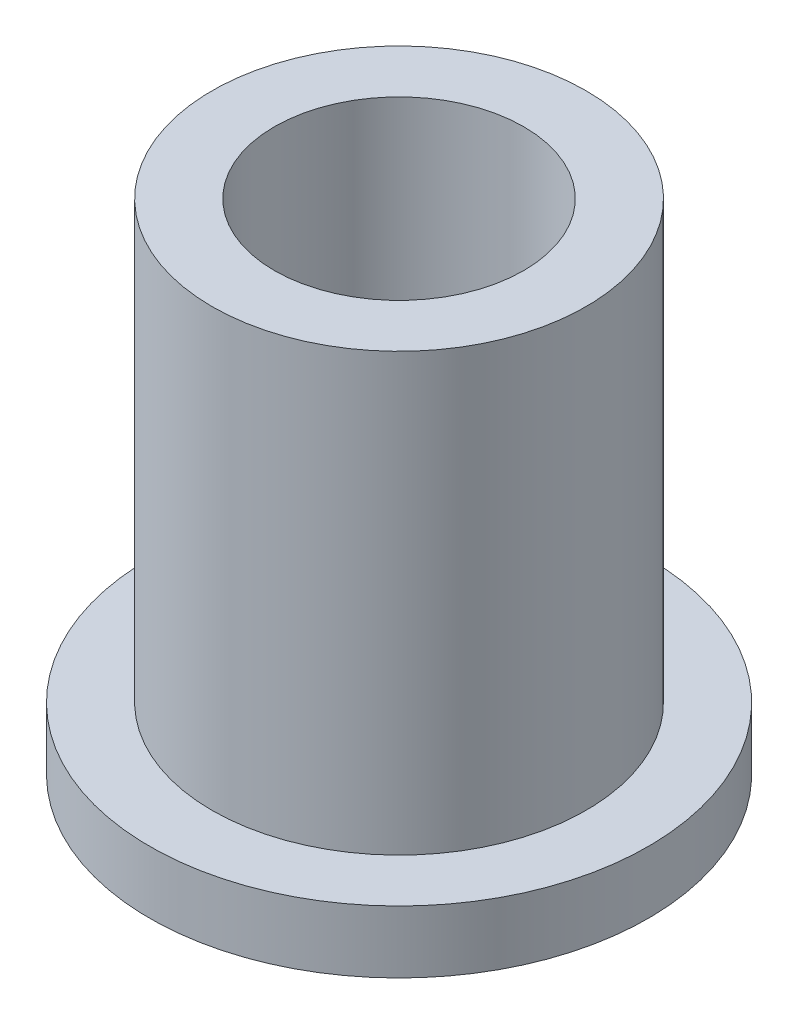
ISO-10303-21;
HEADER;
FILE_DESCRIPTION(('STEP AP214'),'2;1');
FILE_NAME('part.step','',(''),(''),'','','');
FILE_SCHEMA(('AUTOMOTIVE_DESIGN { 1 0 10303 214 1 1 1 1 }'));
ENDSEC;
DATA;
#1=APPLICATION_CONTEXT('core data for automotive mechanical design processes');
#2=APPLICATION_PROTOCOL_DEFINITION('international standard','automotive_design',2000,#1);
#3=PRODUCT_CONTEXT('',#1,'mechanical');
#4=PRODUCT('Part','Part','',(#3));
#5=PRODUCT_RELATED_PRODUCT_CATEGORY('part','',(#4));
#6=PRODUCT_DEFINITION_FORMATION('','',#4);
#7=PRODUCT_DEFINITION_CONTEXT('part definition',#1,'design');
#8=PRODUCT_DEFINITION('design','',#6,#7);
#9=PRODUCT_DEFINITION_SHAPE('','',#8);
#10=(LENGTH_UNIT() NAMED_UNIT(*) SI_UNIT(.MILLI.,.METRE.));
#11=(NAMED_UNIT(*) PLANE_ANGLE_UNIT() SI_UNIT($,.RADIAN.));
#12=(NAMED_UNIT(*) SI_UNIT($,.STERADIAN.) SOLID_ANGLE_UNIT());
#13=UNCERTAINTY_MEASURE_WITH_UNIT(LENGTH_MEASURE(1.E-05),#10,'distance_accuracy_value','');
#14=(GEOMETRIC_REPRESENTATION_CONTEXT(3) GLOBAL_UNCERTAINTY_ASSIGNED_CONTEXT((#13)) GLOBAL_UNIT_ASSIGNED_CONTEXT((#10,
#11,#12)) REPRESENTATION_CONTEXT('',''));
#15=CARTESIAN_POINT('',(0.,0.,0.));
#16=DIRECTION('',(0.,0.,1.));
#17=DIRECTION('',(1.,0.,0.));
#18=AXIS2_PLACEMENT_3D('',#15,#16,#17);
#19=CARTESIAN_POINT('',(0.,12.7,0.));
#20=DIRECTION('',(0.,-1.,0.));
#21=DIRECTION('',(0.,0.,-1.));
#22=AXIS2_PLACEMENT_3D('',#19,#20,#21);
#23=CYLINDRICAL_SURFACE('',#22,4.7625);
#24=CARTESIAN_POINT('',(0.,12.7,0.));
#25=DIRECTION('',(0.,1.,0.));
#26=DIRECTION('',(0.,0.,1.));
#27=AXIS2_PLACEMENT_3D('',#24,#25,#26);
#28=CIRCLE('',#27,4.7625);
#29=CARTESIAN_POINT('',(0.,12.7,4.7625));
#30=VERTEX_POINT('',#29);
#31=EDGE_CURVE('E37',#30,#30,#28,.T.);
#32=ORIENTED_EDGE('',*,*,#31,.F.);
#33=EDGE_LOOP('',(#32));
#34=FACE_BOUND('',#33,.T.);
#35=CARTESIAN_POINT('',(0.,1.5875,0.));
#36=DIRECTION('',(0.,-1.,0.));
#37=DIRECTION('',(0.,0.,-1.));
#38=AXIS2_PLACEMENT_3D('',#35,#36,#37);
#39=CIRCLE('',#38,4.7625);
#40=CARTESIAN_POINT('',(0.,1.5875,-4.7625));
#41=VERTEX_POINT('',#40);
#42=EDGE_CURVE('E10',#41,#41,#39,.T.);
#43=ORIENTED_EDGE('',*,*,#42,.F.);
#44=EDGE_LOOP('',(#43));
#45=FACE_BOUND('',#44,.T.);
#46=ADVANCED_FACE('F31',(#34,#45),#23,.T.);
#47=CARTESIAN_POINT('',(0.,12.7,0.));
#48=DIRECTION('',(0.,1.,0.));
#49=DIRECTION('',(0.,0.,1.));
#50=AXIS2_PLACEMENT_3D('',#47,#48,#49);
#51=PLANE('',#50);
#52=ORIENTED_EDGE('',*,*,#31,.T.);
#53=EDGE_LOOP('',(#52));
#54=FACE_BOUND('',#53,.T.);
#55=CARTESIAN_POINT('',(0.,12.7,0.));
#56=DIRECTION('',(0.,1.,0.));
#57=DIRECTION('',(0.,0.,1.));
#58=AXIS2_PLACEMENT_3D('',#55,#56,#57);
#59=CIRCLE('',#58,3.175);
#60=CARTESIAN_POINT('',(0.,12.7,3.175));
#61=VERTEX_POINT('',#60);
#62=EDGE_CURVE('E41',#61,#61,#59,.T.);
#63=ORIENTED_EDGE('',*,*,#62,.F.);
#64=EDGE_LOOP('',(#63));
#65=FACE_BOUND('',#64,.T.);
#66=ADVANCED_FACE('F69',(#54,#65),#51,.T.);
#67=CARTESIAN_POINT('',(0.,0.,0.));
#68=DIRECTION('',(0.,1.,0.));
#69=DIRECTION('',(0.,0.,1.));
#70=AXIS2_PLACEMENT_3D('',#67,#68,#69);
#71=PLANE('',#70);
#72=CARTESIAN_POINT('',(0.,0.,0.));
#73=DIRECTION('',(0.,1.,0.));
#74=DIRECTION('',(0.,0.,1.));
#75=AXIS2_PLACEMENT_3D('',#72,#73,#74);
#76=CIRCLE('',#75,3.175);
#77=CARTESIAN_POINT('',(0.,0.,3.175));
#78=VERTEX_POINT('',#77);
#79=EDGE_CURVE('E45',#78,#78,#76,.T.);
#80=ORIENTED_EDGE('',*,*,#79,.T.);
#81=EDGE_LOOP('',(#80));
#82=FACE_BOUND('',#81,.T.);
#83=CARTESIAN_POINT('',(0.,0.,0.));
#84=DIRECTION('',(0.,-1.,0.));
#85=DIRECTION('',(0.,0.,-1.));
#86=AXIS2_PLACEMENT_3D('',#83,#84,#85);
#87=CIRCLE('',#86,6.35);
#88=CARTESIAN_POINT('',(0.,0.,-6.35));
#89=VERTEX_POINT('',#88);
#90=EDGE_CURVE('E51',#89,#89,#87,.T.);
#91=ORIENTED_EDGE('',*,*,#90,.T.);
#92=EDGE_LOOP('',(#91));
#93=FACE_BOUND('',#92,.T.);
#94=ADVANCED_FACE('F74',(#82,#93),#71,.F.);
#95=CARTESIAN_POINT('',(0.,12.7,0.));
#96=DIRECTION('',(0.,-1.,0.));
#97=DIRECTION('',(0.,0.,-1.));
#98=AXIS2_PLACEMENT_3D('',#95,#96,#97);
#99=CYLINDRICAL_SURFACE('',#98,3.175);
#100=ORIENTED_EDGE('',*,*,#62,.T.);
#101=EDGE_LOOP('',(#100));
#102=FACE_BOUND('',#101,.T.);
#103=ORIENTED_EDGE('',*,*,#79,.F.);
#104=EDGE_LOOP('',(#103));
#105=FACE_BOUND('',#104,.T.);
#106=ADVANCED_FACE('F66',(#102,#105),#99,.F.);
#107=CARTESIAN_POINT('',(0.,1.5875,0.));
#108=DIRECTION('',(0.,-1.,0.));
#109=DIRECTION('',(0.,0.,-1.));
#110=AXIS2_PLACEMENT_3D('',#107,#108,#109);
#111=CYLINDRICAL_SURFACE('',#110,6.35);
#112=CARTESIAN_POINT('',(0.,1.5875,0.));
#113=DIRECTION('',(0.,-1.,0.));
#114=DIRECTION('',(0.,0.,-1.));
#115=AXIS2_PLACEMENT_3D('',#112,#113,#114);
#116=CIRCLE('',#115,6.35);
#117=CARTESIAN_POINT('',(0.,1.5875,-6.35));
#118=VERTEX_POINT('',#117);
#119=EDGE_CURVE('E49',#118,#118,#116,.T.);
#120=ORIENTED_EDGE('',*,*,#119,.T.);
#121=EDGE_LOOP('',(#120));
#122=FACE_BOUND('',#121,.T.);
#123=ORIENTED_EDGE('',*,*,#90,.F.);
#124=EDGE_LOOP('',(#123));
#125=FACE_BOUND('',#124,.T.);
#126=ADVANCED_FACE('F57',(#122,#125),#111,.T.);
#127=CARTESIAN_POINT('',(0.,1.5875,0.));
#128=DIRECTION('',(0.,-1.,0.));
#129=DIRECTION('',(0.,0.,-1.));
#130=AXIS2_PLACEMENT_3D('',#127,#128,#129);
#131=PLANE('',#130);
#132=ORIENTED_EDGE('',*,*,#42,.T.);
#133=EDGE_LOOP('',(#132));
#134=FACE_BOUND('',#133,.T.);
#135=ORIENTED_EDGE('',*,*,#119,.F.);
#136=EDGE_LOOP('',(#135));
#137=FACE_BOUND('',#136,.T.);
#138=ADVANCED_FACE('F60',(#134,#137),#131,.F.);
#139=CLOSED_SHELL('',(#46,#66,#94,#106,#126,#138));
#140=MANIFOLD_SOLID_BREP('B2',#139);
#141=ADVANCED_BREP_SHAPE_REPRESENTATION('',(#18,#140),#14);
#142=SHAPE_DEFINITION_REPRESENTATION(#9,#141);
ENDSEC;
END-ISO-10303-21;
